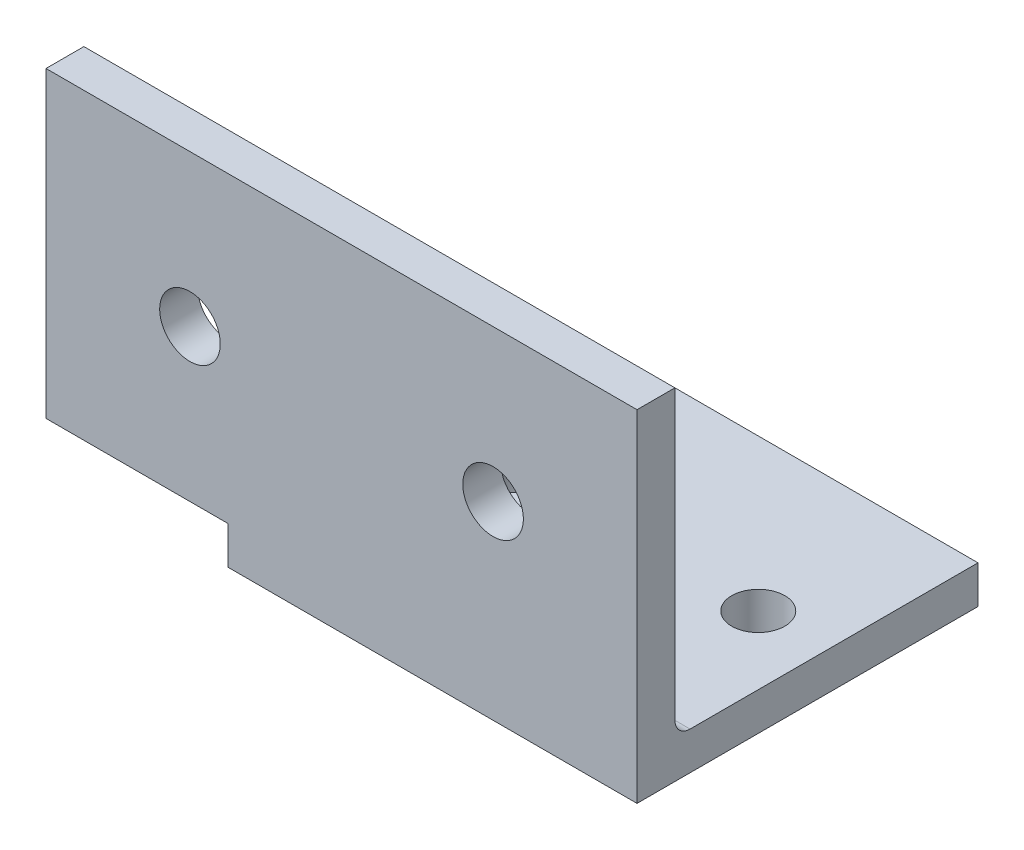
ISO-10303-21;
HEADER;
FILE_DESCRIPTION(('STEP AP214'),'2;1');
FILE_NAME('part.step','',(''),(''),'','','');
FILE_SCHEMA(('AUTOMOTIVE_DESIGN { 1 0 10303 214 1 1 1 1 }'));
ENDSEC;
DATA;
#1=APPLICATION_CONTEXT('core data for automotive mechanical design processes');
#2=APPLICATION_PROTOCOL_DEFINITION('international standard','automotive_design',2000,#1);
#3=PRODUCT_CONTEXT('',#1,'mechanical');
#4=PRODUCT('Part','Part','',(#3));
#5=PRODUCT_RELATED_PRODUCT_CATEGORY('part','',(#4));
#6=PRODUCT_DEFINITION_FORMATION('','',#4);
#7=PRODUCT_DEFINITION_CONTEXT('part definition',#1,'design');
#8=PRODUCT_DEFINITION('design','',#6,#7);
#9=PRODUCT_DEFINITION_SHAPE('','',#8);
#10=(LENGTH_UNIT() NAMED_UNIT(*) SI_UNIT(.MILLI.,.METRE.));
#11=(NAMED_UNIT(*) PLANE_ANGLE_UNIT() SI_UNIT($,.RADIAN.));
#12=(NAMED_UNIT(*) SI_UNIT($,.STERADIAN.) SOLID_ANGLE_UNIT());
#13=UNCERTAINTY_MEASURE_WITH_UNIT(LENGTH_MEASURE(1.E-05),#10,'distance_accuracy_value','');
#14=(GEOMETRIC_REPRESENTATION_CONTEXT(3) GLOBAL_UNCERTAINTY_ASSIGNED_CONTEXT((#13)) GLOBAL_UNIT_ASSIGNED_CONTEXT((#10,
#11,#12)) REPRESENTATION_CONTEXT('',''));
#15=CARTESIAN_POINT('',(0.,0.,0.));
#16=DIRECTION('',(0.,0.,1.));
#17=DIRECTION('',(1.,0.,0.));
#18=AXIS2_PLACEMENT_3D('',#15,#16,#17);
#19=CARTESIAN_POINT('',(0.,3.175,0.));
#20=DIRECTION('',(1.,0.,0.));
#21=DIRECTION('',(0.,0.,-1.));
#22=AXIS2_PLACEMENT_3D('',#19,#20,#21);
#23=PLANE('',#22);
#24=DIRECTION('',(0.,0.,1.));
#25=VECTOR('',#24,1.);
#26=CARTESIAN_POINT('',(0.,3.175,0.));
#27=LINE('',#26,#25);
#28=CARTESIAN_POINT('',(0.,3.175,-3.175));
#29=VERTEX_POINT('',#28);
#30=CARTESIAN_POINT('',(0.,3.175,0.));
#31=VERTEX_POINT('',#30);
#32=EDGE_CURVE('E166',#29,#31,#27,.T.);
#33=ORIENTED_EDGE('',*,*,#32,.T.);
#34=DIRECTION('',(0.,-1.,0.));
#35=VECTOR('',#34,1.);
#36=CARTESIAN_POINT('',(0.,3.175,0.));
#37=LINE('',#36,#35);
#38=CARTESIAN_POINT('',(0.,28.575,0.));
#39=VERTEX_POINT('',#38);
#40=EDGE_CURVE('E142',#39,#31,#37,.T.);
#41=ORIENTED_EDGE('',*,*,#40,.F.);
#42=DIRECTION('',(0.,0.,1.));
#43=VECTOR('',#42,1.);
#44=CARTESIAN_POINT('',(0.,28.575,0.));
#45=LINE('',#44,#43);
#46=CARTESIAN_POINT('',(0.,28.575,-3.175));
#47=VERTEX_POINT('',#46);
#48=EDGE_CURVE('E185',#47,#39,#45,.T.);
#49=ORIENTED_EDGE('',*,*,#48,.F.);
#50=DIRECTION('',(0.,-1.,0.));
#51=VECTOR('',#50,1.);
#52=CARTESIAN_POINT('',(0.,28.575,-3.175));
#53=LINE('',#52,#51);
#54=EDGE_CURVE('E195',#47,#29,#53,.T.);
#55=ORIENTED_EDGE('',*,*,#54,.T.);
#56=EDGE_LOOP('',(#33,#41,#49,#55));
#57=FACE_BOUND('',#56,.T.);
#58=ADVANCED_FACE('F36',(#57),#23,.F.);
#59=CARTESIAN_POINT('',(0.,3.175,0.));
#60=DIRECTION('',(0.,-1.,0.));
#61=DIRECTION('',(0.,0.,-1.));
#62=AXIS2_PLACEMENT_3D('',#59,#60,#61);
#63=PLANE('',#62);
#64=CARTESIAN_POINT('',(43.815,3.175,-15.875));
#65=DIRECTION('',(0.,1.,0.));
#66=DIRECTION('',(0.,0.,1.));
#67=AXIS2_PLACEMENT_3D('',#64,#65,#66);
#68=CIRCLE('',#67,2.2225);
#69=CARTESIAN_POINT('',(43.815,3.175,-13.6525));
#70=VERTEX_POINT('',#69);
#71=EDGE_CURVE('E201',#70,#70,#68,.T.);
#72=ORIENTED_EDGE('',*,*,#71,.F.);
#73=EDGE_LOOP('',(#72));
#74=FACE_BOUND('',#73,.T.);
#75=CARTESIAN_POINT('',(23.495,3.175,-15.875));
#76=DIRECTION('',(0.,1.,0.));
#77=DIRECTION('',(0.,0.,1.));
#78=AXIS2_PLACEMENT_3D('',#75,#76,#77);
#79=CIRCLE('',#78,2.2225);
#80=CARTESIAN_POINT('',(23.495,3.175,-13.6525));
#81=VERTEX_POINT('',#80);
#82=EDGE_CURVE('E207',#81,#81,#79,.T.);
#83=ORIENTED_EDGE('',*,*,#82,.F.);
#84=EDGE_LOOP('',(#83));
#85=FACE_BOUND('',#84,.T.);
#86=DIRECTION('',(0.,0.,-1.));
#87=VECTOR('',#86,1.);
#88=CARTESIAN_POINT('',(15.24,3.175,0.));
#89=LINE('',#88,#87);
#90=CARTESIAN_POINT('',(15.24,3.175,-4.445));
#91=VERTEX_POINT('',#90);
#92=CARTESIAN_POINT('',(15.24,3.175,-28.575));
#93=VERTEX_POINT('',#92);
#94=EDGE_CURVE('E110',#91,#93,#89,.T.);
#95=ORIENTED_EDGE('',*,*,#94,.F.);
#96=DIRECTION('',(-1.,0.,0.));
#97=VECTOR('',#96,1.);
#98=CARTESIAN_POINT('',(49.53,3.175,-4.445));
#99=LINE('',#98,#97);
#100=CARTESIAN_POINT('',(49.53,3.175,-4.445));
#101=VERTEX_POINT('',#100);
#102=EDGE_CURVE('E51',#91,#101,#99,.F.);
#103=ORIENTED_EDGE('',*,*,#102,.T.);
#104=DIRECTION('',(0.,0.,-1.));
#105=VECTOR('',#104,1.);
#106=CARTESIAN_POINT('',(49.53,3.175,0.));
#107=LINE('',#106,#105);
#108=CARTESIAN_POINT('',(49.53,3.175,-28.575));
#109=VERTEX_POINT('',#108);
#110=EDGE_CURVE('E130',#101,#109,#107,.T.);
#111=ORIENTED_EDGE('',*,*,#110,.T.);
#112=DIRECTION('',(-1.,0.,0.));
#113=VECTOR('',#112,1.);
#114=CARTESIAN_POINT('',(0.,3.175,-28.575));
#115=LINE('',#114,#113);
#116=EDGE_CURVE('E133',#109,#93,#115,.T.);
#117=ORIENTED_EDGE('',*,*,#116,.T.);
#118=EDGE_LOOP('',(#95,#103,#111,#117));
#119=FACE_BOUND('',#118,.T.);
#120=ADVANCED_FACE('F236',(#74,#85,#119),#63,.F.);
#121=CARTESIAN_POINT('',(0.,0.,0.));
#122=DIRECTION('',(0.,-1.,0.));
#123=DIRECTION('',(0.,0.,-1.));
#124=AXIS2_PLACEMENT_3D('',#121,#122,#123);
#125=PLANE('',#124);
#126=DIRECTION('',(0.,0.,1.));
#127=VECTOR('',#126,1.);
#128=CARTESIAN_POINT('',(15.24,0.,0.));
#129=LINE('',#128,#127);
#130=CARTESIAN_POINT('',(15.24,0.,-28.575));
#131=VERTEX_POINT('',#130);
#132=CARTESIAN_POINT('',(15.24,0.,0.));
#133=VERTEX_POINT('',#132);
#134=EDGE_CURVE('E108',#131,#133,#129,.T.);
#135=ORIENTED_EDGE('',*,*,#134,.F.);
#136=DIRECTION('',(-1.,0.,0.));
#137=VECTOR('',#136,1.);
#138=CARTESIAN_POINT('',(0.,0.,-28.575));
#139=LINE('',#138,#137);
#140=CARTESIAN_POINT('',(49.53,0.,-28.575));
#141=VERTEX_POINT('',#140);
#142=EDGE_CURVE('E123',#141,#131,#139,.T.);
#143=ORIENTED_EDGE('',*,*,#142,.F.);
#144=DIRECTION('',(0.,0.,-1.));
#145=VECTOR('',#144,1.);
#146=CARTESIAN_POINT('',(49.53,0.,0.));
#147=LINE('',#146,#145);
#148=CARTESIAN_POINT('',(49.53,0.,0.));
#149=VERTEX_POINT('',#148);
#150=EDGE_CURVE('E131',#149,#141,#147,.T.);
#151=ORIENTED_EDGE('',*,*,#150,.F.);
#152=DIRECTION('',(1.,0.,0.));
#153=VECTOR('',#152,1.);
#154=CARTESIAN_POINT('',(0.,0.,0.));
#155=LINE('',#154,#153);
#156=EDGE_CURVE('E124',#133,#149,#155,.T.);
#157=ORIENTED_EDGE('',*,*,#156,.F.);
#158=EDGE_LOOP('',(#135,#143,#151,#157));
#159=FACE_BOUND('',#158,.T.);
#160=CARTESIAN_POINT('',(23.495,0.,-15.875));
#161=DIRECTION('',(0.,1.,0.));
#162=DIRECTION('',(0.,0.,1.));
#163=AXIS2_PLACEMENT_3D('',#160,#161,#162);
#164=CIRCLE('',#163,2.2225);
#165=CARTESIAN_POINT('',(23.495,0.,-13.6525));
#166=VERTEX_POINT('',#165);
#167=EDGE_CURVE('E204',#166,#166,#164,.T.);
#168=ORIENTED_EDGE('',*,*,#167,.T.);
#169=EDGE_LOOP('',(#168));
#170=FACE_BOUND('',#169,.T.);
#171=CARTESIAN_POINT('',(43.815,0.,-15.875));
#172=DIRECTION('',(0.,1.,0.));
#173=DIRECTION('',(0.,0.,1.));
#174=AXIS2_PLACEMENT_3D('',#171,#172,#173);
#175=CIRCLE('',#174,2.2225);
#176=CARTESIAN_POINT('',(43.815,0.,-13.6525));
#177=VERTEX_POINT('',#176);
#178=EDGE_CURVE('E200',#177,#177,#175,.T.);
#179=ORIENTED_EDGE('',*,*,#178,.T.);
#180=EDGE_LOOP('',(#179));
#181=FACE_BOUND('',#180,.T.);
#182=ADVANCED_FACE('F120',(#159,#170,#181),#125,.T.);
#183=CARTESIAN_POINT('',(0.,3.175,0.));
#184=DIRECTION('',(0.,0.,-1.));
#185=DIRECTION('',(-1.,0.,0.));
#186=AXIS2_PLACEMENT_3D('',#183,#184,#185);
#187=PLANE('',#186);
#188=CARTESIAN_POINT('',(12.065,15.875,0.));
#189=DIRECTION('',(0.,0.,-1.));
#190=DIRECTION('',(-1.,0.,0.));
#191=AXIS2_PLACEMENT_3D('',#188,#189,#190);
#192=CIRCLE('',#191,2.54);
#193=CARTESIAN_POINT('',(9.525,15.875,0.));
#194=VERTEX_POINT('',#193);
#195=EDGE_CURVE('E176',#194,#194,#192,.F.);
#196=ORIENTED_EDGE('',*,*,#195,.F.);
#197=EDGE_LOOP('',(#196));
#198=FACE_BOUND('',#197,.T.);
#199=CARTESIAN_POINT('',(37.465,15.875,0.));
#200=DIRECTION('',(0.,0.,-1.));
#201=DIRECTION('',(-1.,0.,0.));
#202=AXIS2_PLACEMENT_3D('',#199,#200,#201);
#203=CIRCLE('',#202,2.54);
#204=CARTESIAN_POINT('',(34.925,15.875,0.));
#205=VERTEX_POINT('',#204);
#206=EDGE_CURVE('E177',#205,#205,#203,.F.);
#207=ORIENTED_EDGE('',*,*,#206,.F.);
#208=EDGE_LOOP('',(#207));
#209=FACE_BOUND('',#208,.T.);
#210=DIRECTION('',(1.,0.,0.));
#211=VECTOR('',#210,1.);
#212=CARTESIAN_POINT('',(0.,3.175,0.));
#213=LINE('',#212,#211);
#214=CARTESIAN_POINT('',(15.24,3.175,0.));
#215=VERTEX_POINT('',#214);
#216=EDGE_CURVE('E164',#31,#215,#213,.T.);
#217=ORIENTED_EDGE('',*,*,#216,.T.);
#218=DIRECTION('',(0.,-1.,0.));
#219=VECTOR('',#218,1.);
#220=CARTESIAN_POINT('',(15.24,35.56,0.));
#221=LINE('',#220,#219);
#222=EDGE_CURVE('E115',#215,#133,#221,.T.);
#223=ORIENTED_EDGE('',*,*,#222,.T.);
#224=ORIENTED_EDGE('',*,*,#156,.T.);
#225=DIRECTION('',(0.,-1.,0.));
#226=VECTOR('',#225,1.);
#227=CARTESIAN_POINT('',(49.53,3.175,0.));
#228=LINE('',#227,#226);
#229=CARTESIAN_POINT('',(49.53,28.575,0.));
#230=VERTEX_POINT('',#229);
#231=EDGE_CURVE('E139',#230,#149,#228,.T.);
#232=ORIENTED_EDGE('',*,*,#231,.F.);
#233=DIRECTION('',(1.,0.,0.));
#234=VECTOR('',#233,1.);
#235=CARTESIAN_POINT('',(0.,28.575,0.));
#236=LINE('',#235,#234);
#237=EDGE_CURVE('E188',#39,#230,#236,.T.);
#238=ORIENTED_EDGE('',*,*,#237,.F.);
#239=ORIENTED_EDGE('',*,*,#40,.T.);
#240=EDGE_LOOP('',(#217,#223,#224,#232,#238,#239));
#241=FACE_BOUND('',#240,.T.);
#242=ADVANCED_FACE('F213',(#198,#209,#241),#187,.F.);
#243=CARTESIAN_POINT('',(49.53,3.175,0.));
#244=DIRECTION('',(-1.,0.,0.));
#245=DIRECTION('',(0.,0.,1.));
#246=AXIS2_PLACEMENT_3D('',#243,#244,#245);
#247=PLANE('',#246);
#248=ORIENTED_EDGE('',*,*,#150,.T.);
#249=DIRECTION('',(0.,-1.,0.));
#250=VECTOR('',#249,1.);
#251=CARTESIAN_POINT('',(49.53,3.175,-28.575));
#252=LINE('',#251,#250);
#253=EDGE_CURVE('E129',#109,#141,#252,.T.);
#254=ORIENTED_EDGE('',*,*,#253,.F.);
#255=ORIENTED_EDGE('',*,*,#110,.F.);
#256=CARTESIAN_POINT('',(49.53,4.445,-4.445));
#257=DIRECTION('',(-1.,0.,0.));
#258=DIRECTION('',(0.,0.,1.));
#259=AXIS2_PLACEMENT_3D('',#256,#257,#258);
#260=CIRCLE('',#259,1.27);
#261=CARTESIAN_POINT('',(49.53,4.445,-3.175));
#262=VERTEX_POINT('',#261);
#263=EDGE_CURVE('E11',#101,#262,#260,.T.);
#264=ORIENTED_EDGE('',*,*,#263,.T.);
#265=DIRECTION('',(0.,-1.,0.));
#266=VECTOR('',#265,1.);
#267=CARTESIAN_POINT('',(49.53,28.575,-3.175));
#268=LINE('',#267,#266);
#269=CARTESIAN_POINT('',(49.53,28.575,-3.175));
#270=VERTEX_POINT('',#269);
#271=EDGE_CURVE('E158',#270,#262,#268,.T.);
#272=ORIENTED_EDGE('',*,*,#271,.F.);
#273=DIRECTION('',(0.,0.,-1.));
#274=VECTOR('',#273,1.);
#275=CARTESIAN_POINT('',(49.53,28.575,0.));
#276=LINE('',#275,#274);
#277=EDGE_CURVE('E191',#230,#270,#276,.T.);
#278=ORIENTED_EDGE('',*,*,#277,.F.);
#279=ORIENTED_EDGE('',*,*,#231,.T.);
#280=EDGE_LOOP('',(#248,#254,#255,#264,#272,#278,#279));
#281=FACE_BOUND('',#280,.T.);
#282=ADVANCED_FACE('F217',(#281),#247,.F.);
#283=CARTESIAN_POINT('',(0.,3.175,-28.575));
#284=DIRECTION('',(0.,0.,1.));
#285=DIRECTION('',(1.,0.,0.));
#286=AXIS2_PLACEMENT_3D('',#283,#284,#285);
#287=PLANE('',#286);
#288=ORIENTED_EDGE('',*,*,#142,.T.);
#289=DIRECTION('',(0.,-1.,0.));
#290=VECTOR('',#289,1.);
#291=CARTESIAN_POINT('',(15.24,35.56,-28.575));
#292=LINE('',#291,#290);
#293=EDGE_CURVE('E103',#93,#131,#292,.T.);
#294=ORIENTED_EDGE('',*,*,#293,.F.);
#295=ORIENTED_EDGE('',*,*,#116,.F.);
#296=ORIENTED_EDGE('',*,*,#253,.T.);
#297=EDGE_LOOP('',(#288,#294,#295,#296));
#298=FACE_BOUND('',#297,.T.);
#299=ADVANCED_FACE('F127',(#298),#287,.F.);
#300=CARTESIAN_POINT('',(23.495,3.175,-15.875));
#301=DIRECTION('',(0.,-1.,0.));
#302=DIRECTION('',(0.,0.,-1.));
#303=AXIS2_PLACEMENT_3D('',#300,#301,#302);
#304=CYLINDRICAL_SURFACE('',#303,2.2225);
#305=ORIENTED_EDGE('',*,*,#82,.T.);
#306=EDGE_LOOP('',(#305));
#307=FACE_BOUND('',#306,.T.);
#308=ORIENTED_EDGE('',*,*,#167,.F.);
#309=EDGE_LOOP('',(#308));
#310=FACE_BOUND('',#309,.T.);
#311=ADVANCED_FACE('F250',(#307,#310),#304,.F.);
#312=CARTESIAN_POINT('',(43.815,3.175,-15.875));
#313=DIRECTION('',(0.,-1.,0.));
#314=DIRECTION('',(0.,0.,-1.));
#315=AXIS2_PLACEMENT_3D('',#312,#313,#314);
#316=CYLINDRICAL_SURFACE('',#315,2.2225);
#317=ORIENTED_EDGE('',*,*,#71,.T.);
#318=EDGE_LOOP('',(#317));
#319=FACE_BOUND('',#318,.T.);
#320=ORIENTED_EDGE('',*,*,#178,.F.);
#321=EDGE_LOOP('',(#320));
#322=FACE_BOUND('',#321,.T.);
#323=ADVANCED_FACE('F255',(#319,#322),#316,.F.);
#324=CARTESIAN_POINT('',(0.,28.575,-3.175));
#325=DIRECTION('',(0.,0.,1.));
#326=DIRECTION('',(1.,0.,0.));
#327=AXIS2_PLACEMENT_3D('',#324,#325,#326);
#328=PLANE('',#327);
#329=CARTESIAN_POINT('',(12.065,15.875,-3.175));
#330=DIRECTION('',(0.,0.,-1.));
#331=DIRECTION('',(-1.,0.,0.));
#332=AXIS2_PLACEMENT_3D('',#329,#330,#331);
#333=CIRCLE('',#332,2.54);
#334=CARTESIAN_POINT('',(9.525,15.875,-3.175));
#335=VERTEX_POINT('',#334);
#336=EDGE_CURVE('E173',#335,#335,#333,.T.);
#337=ORIENTED_EDGE('',*,*,#336,.F.);
#338=EDGE_LOOP('',(#337));
#339=FACE_BOUND('',#338,.T.);
#340=CARTESIAN_POINT('',(37.465,15.875,-3.175));
#341=DIRECTION('',(0.,0.,-1.));
#342=DIRECTION('',(1.,0.,0.));
#343=AXIS2_PLACEMENT_3D('',#340,#341,#342);
#344=CIRCLE('',#343,2.54);
#345=CARTESIAN_POINT('',(40.005,15.875,-3.175));
#346=VERTEX_POINT('',#345);
#347=EDGE_CURVE('E170',#346,#346,#344,.T.);
#348=ORIENTED_EDGE('',*,*,#347,.F.);
#349=EDGE_LOOP('',(#348));
#350=FACE_BOUND('',#349,.T.);
#351=ORIENTED_EDGE('',*,*,#271,.T.);
#352=DIRECTION('',(-1.,0.,0.));
#353=VECTOR('',#352,1.);
#354=CARTESIAN_POINT('',(15.24,4.445,-3.175));
#355=LINE('',#354,#353);
#356=CARTESIAN_POINT('',(15.24,4.445,-3.175));
#357=VERTEX_POINT('',#356);
#358=EDGE_CURVE('E147',#262,#357,#355,.T.);
#359=ORIENTED_EDGE('',*,*,#358,.T.);
#360=DIRECTION('',(0.,-1.,0.));
#361=VECTOR('',#360,1.);
#362=CARTESIAN_POINT('',(15.24,35.56,-3.175));
#363=LINE('',#362,#361);
#364=CARTESIAN_POINT('',(15.24,3.175,-3.175));
#365=VERTEX_POINT('',#364);
#366=EDGE_CURVE('E145',#357,#365,#363,.T.);
#367=ORIENTED_EDGE('',*,*,#366,.T.);
#368=DIRECTION('',(-1.,0.,0.));
#369=VECTOR('',#368,1.);
#370=CARTESIAN_POINT('',(0.,3.175,-3.175));
#371=LINE('',#370,#369);
#372=EDGE_CURVE('E180',#365,#29,#371,.T.);
#373=ORIENTED_EDGE('',*,*,#372,.T.);
#374=ORIENTED_EDGE('',*,*,#54,.F.);
#375=DIRECTION('',(-1.,0.,0.));
#376=VECTOR('',#375,1.);
#377=CARTESIAN_POINT('',(0.,28.575,-3.175));
#378=LINE('',#377,#376);
#379=EDGE_CURVE('E193',#270,#47,#378,.T.);
#380=ORIENTED_EDGE('',*,*,#379,.F.);
#381=EDGE_LOOP('',(#351,#359,#367,#373,#374,#380));
#382=FACE_BOUND('',#381,.T.);
#383=ADVANCED_FACE('F153',(#339,#350,#382),#328,.F.);
#384=CARTESIAN_POINT('',(0.,28.575,0.));
#385=DIRECTION('',(0.,-1.,0.));
#386=DIRECTION('',(0.,0.,-1.));
#387=AXIS2_PLACEMENT_3D('',#384,#385,#386);
#388=PLANE('',#387);
#389=ORIENTED_EDGE('',*,*,#48,.T.);
#390=ORIENTED_EDGE('',*,*,#237,.T.);
#391=ORIENTED_EDGE('',*,*,#277,.T.);
#392=ORIENTED_EDGE('',*,*,#379,.T.);
#393=EDGE_LOOP('',(#389,#390,#391,#392));
#394=FACE_BOUND('',#393,.T.);
#395=ADVANCED_FACE('F219',(#394),#388,.F.);
#396=CARTESIAN_POINT('',(37.465,15.875,7.18420489685533));
#397=DIRECTION('',(0.,0.,-1.));
#398=DIRECTION('',(-1.,0.,0.));
#399=AXIS2_PLACEMENT_3D('',#396,#397,#398);
#400=CYLINDRICAL_SURFACE('',#399,2.54);
#401=ORIENTED_EDGE('',*,*,#206,.T.);
#402=EDGE_LOOP('',(#401));
#403=FACE_BOUND('',#402,.T.);
#404=ORIENTED_EDGE('',*,*,#347,.T.);
#405=EDGE_LOOP('',(#404));
#406=FACE_BOUND('',#405,.T.);
#407=ADVANCED_FACE('F232',(#403,#406),#400,.F.);
#408=CARTESIAN_POINT('',(12.065,15.875,7.18420489685533));
#409=DIRECTION('',(0.,0.,-1.));
#410=DIRECTION('',(-1.,0.,0.));
#411=AXIS2_PLACEMENT_3D('',#408,#409,#410);
#412=CYLINDRICAL_SURFACE('',#411,2.54);
#413=ORIENTED_EDGE('',*,*,#195,.T.);
#414=EDGE_LOOP('',(#413));
#415=FACE_BOUND('',#414,.T.);
#416=ORIENTED_EDGE('',*,*,#336,.T.);
#417=EDGE_LOOP('',(#416));
#418=FACE_BOUND('',#417,.T.);
#419=ADVANCED_FACE('F225',(#415,#418),#412,.F.);
#420=CARTESIAN_POINT('',(0.,3.175,0.));
#421=DIRECTION('',(0.,-1.,0.));
#422=DIRECTION('',(0.,0.,-1.));
#423=AXIS2_PLACEMENT_3D('',#420,#421,#422);
#424=PLANE('',#423);
#425=ORIENTED_EDGE('',*,*,#372,.F.);
#426=EDGE_CURVE('E161',#215,#365,#89,.T.);
#427=ORIENTED_EDGE('',*,*,#426,.F.);
#428=ORIENTED_EDGE('',*,*,#216,.F.);
#429=ORIENTED_EDGE('',*,*,#32,.F.);
#430=EDGE_LOOP('',(#425,#427,#428,#429));
#431=FACE_BOUND('',#430,.T.);
#432=ADVANCED_FACE('F223',(#431),#424,.T.);
#433=CARTESIAN_POINT('',(15.24,35.56,0.));
#434=DIRECTION('',(1.,0.,0.));
#435=DIRECTION('',(0.,0.,-1.));
#436=AXIS2_PLACEMENT_3D('',#433,#434,#435);
#437=PLANE('',#436);
#438=ORIENTED_EDGE('',*,*,#426,.T.);
#439=ORIENTED_EDGE('',*,*,#366,.F.);
#440=CARTESIAN_POINT('',(15.24,4.445,-4.445));
#441=DIRECTION('',(1.,0.,0.));
#442=DIRECTION('',(0.,0.,-1.));
#443=AXIS2_PLACEMENT_3D('',#440,#441,#442);
#444=CIRCLE('',#443,1.27);
#445=EDGE_CURVE('E44',#357,#91,#444,.T.);
#446=ORIENTED_EDGE('',*,*,#445,.T.);
#447=ORIENTED_EDGE('',*,*,#94,.T.);
#448=ORIENTED_EDGE('',*,*,#293,.T.);
#449=ORIENTED_EDGE('',*,*,#134,.T.);
#450=ORIENTED_EDGE('',*,*,#222,.F.);
#451=EDGE_LOOP('',(#438,#439,#446,#447,#448,#449,#450));
#452=FACE_BOUND('',#451,.T.);
#453=ADVANCED_FACE('F106',(#452),#437,.F.);
#454=CARTESIAN_POINT('',(0.,4.445,-4.445));
#455=DIRECTION('',(1.,0.,0.));
#456=DIRECTION('',(0.,0.,-1.));
#457=AXIS2_PLACEMENT_3D('',#454,#455,#456);
#458=CYLINDRICAL_SURFACE('',#457,1.27);
#459=ORIENTED_EDGE('',*,*,#263,.F.);
#460=ORIENTED_EDGE('',*,*,#102,.F.);
#461=ORIENTED_EDGE('',*,*,#445,.F.);
#462=ORIENTED_EDGE('',*,*,#358,.F.);
#463=EDGE_LOOP('',(#459,#460,#461,#462));
#464=FACE_BOUND('',#463,.T.);
#465=ADVANCED_FACE('F38',(#464),#458,.F.);
#466=CLOSED_SHELL('',(#58,#120,#182,#242,#282,#299,#311,#323,#383,#395,#407,#419,#432,#453,#465));
#467=MANIFOLD_SOLID_BREP('B2',#466);
#468=ADVANCED_BREP_SHAPE_REPRESENTATION('',(#18,#467),#14);
#469=SHAPE_DEFINITION_REPRESENTATION(#9,#468);
ENDSEC;
END-ISO-10303-21;
